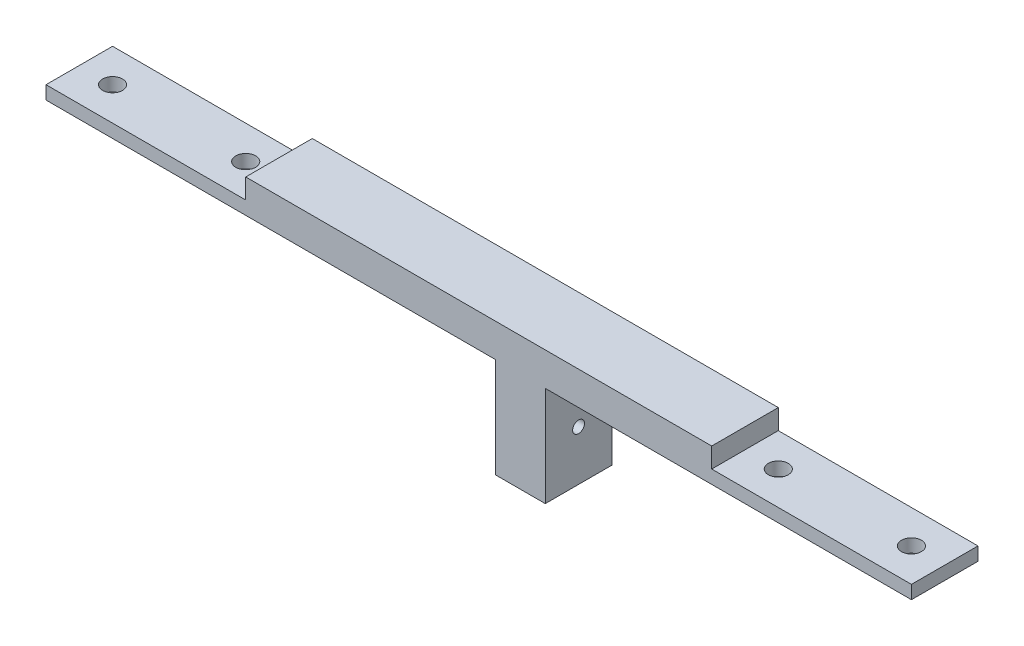
ISO-10303-21;
HEADER;
FILE_DESCRIPTION(('STEP AP214'),'2;1');
FILE_NAME('part.step','',(''),(''),'','','');
FILE_SCHEMA(('AUTOMOTIVE_DESIGN { 1 0 10303 214 1 1 1 1 }'));
ENDSEC;
DATA;
#1=APPLICATION_CONTEXT('core data for automotive mechanical design processes');
#2=APPLICATION_PROTOCOL_DEFINITION('international standard','automotive_design',2000,#1);
#3=PRODUCT_CONTEXT('',#1,'mechanical');
#4=PRODUCT('Part','Part','',(#3));
#5=PRODUCT_RELATED_PRODUCT_CATEGORY('part','',(#4));
#6=PRODUCT_DEFINITION_FORMATION('','',#4);
#7=PRODUCT_DEFINITION_CONTEXT('part definition',#1,'design');
#8=PRODUCT_DEFINITION('design','',#6,#7);
#9=PRODUCT_DEFINITION_SHAPE('','',#8);
#10=(LENGTH_UNIT() NAMED_UNIT(*) SI_UNIT(.MILLI.,.METRE.));
#11=(NAMED_UNIT(*) PLANE_ANGLE_UNIT() SI_UNIT($,.RADIAN.));
#12=(NAMED_UNIT(*) SI_UNIT($,.STERADIAN.) SOLID_ANGLE_UNIT());
#13=UNCERTAINTY_MEASURE_WITH_UNIT(LENGTH_MEASURE(1.E-05),#10,'distance_accuracy_value','');
#14=(GEOMETRIC_REPRESENTATION_CONTEXT(3) GLOBAL_UNCERTAINTY_ASSIGNED_CONTEXT((#13)) GLOBAL_UNIT_ASSIGNED_CONTEXT((#10,
#11,#12)) REPRESENTATION_CONTEXT('',''));
#15=CARTESIAN_POINT('',(0.,0.,0.));
#16=DIRECTION('',(0.,0.,1.));
#17=DIRECTION('',(1.,0.,0.));
#18=AXIS2_PLACEMENT_3D('',#15,#16,#17);
#19=CARTESIAN_POINT('',(0.,0.,0.));
#20=DIRECTION('',(0.,-1.,0.));
#21=DIRECTION('',(0.,0.,-1.));
#22=AXIS2_PLACEMENT_3D('',#19,#20,#21);
#23=PLANE('',#22);
#24=CARTESIAN_POINT('',(-76.2,0.,0.));
#25=DIRECTION('',(0.,-1.,0.));
#26=DIRECTION('',(0.,0.,-1.));
#27=AXIS2_PLACEMENT_3D('',#24,#25,#26);
#28=CIRCLE('',#27,1.89865);
#29=CARTESIAN_POINT('',(-76.2,0.,-1.89865));
#30=VERTEX_POINT('',#29);
#31=EDGE_CURVE('E191',#30,#30,#28,.T.);
#32=ORIENTED_EDGE('',*,*,#31,.F.);
#33=EDGE_LOOP('',(#32));
#34=FACE_BOUND('',#33,.T.);
#35=CARTESIAN_POINT('',(-50.8,0.,0.));
#36=DIRECTION('',(0.,-1.,0.));
#37=DIRECTION('',(0.,0.,-1.));
#38=AXIS2_PLACEMENT_3D('',#35,#36,#37);
#39=CIRCLE('',#38,1.89865);
#40=CARTESIAN_POINT('',(-50.8,0.,-1.89865));
#41=VERTEX_POINT('',#40);
#42=EDGE_CURVE('E184',#41,#41,#39,.T.);
#43=ORIENTED_EDGE('',*,*,#42,.F.);
#44=EDGE_LOOP('',(#43));
#45=FACE_BOUND('',#44,.T.);
#46=DIRECTION('',(1.,0.,0.));
#47=VECTOR('',#46,1.);
#48=CARTESIAN_POINT('',(-82.55,0.,-6.35));
#49=LINE('',#48,#47);
#50=CARTESIAN_POINT('',(-82.55,0.,-6.35));
#51=VERTEX_POINT('',#50);
#52=CARTESIAN_POINT('',(3.175,0.,-6.35));
#53=VERTEX_POINT('',#52);
#54=EDGE_CURVE('E226',#51,#53,#49,.T.);
#55=ORIENTED_EDGE('',*,*,#54,.T.);
#56=DIRECTION('',(0.,0.,1.));
#57=VECTOR('',#56,1.);
#58=CARTESIAN_POINT('',(3.175,0.,-27.6485474856855));
#59=LINE('',#58,#57);
#60=CARTESIAN_POINT('',(3.175,0.,6.35));
#61=VERTEX_POINT('',#60);
#62=EDGE_CURVE('E52',#53,#61,#59,.T.);
#63=ORIENTED_EDGE('',*,*,#62,.T.);
#64=DIRECTION('',(1.,0.,0.));
#65=VECTOR('',#64,1.);
#66=CARTESIAN_POINT('',(-82.55,0.,6.35));
#67=LINE('',#66,#65);
#68=CARTESIAN_POINT('',(-82.55,0.,6.35));
#69=VERTEX_POINT('',#68);
#70=EDGE_CURVE('E220',#69,#61,#67,.T.);
#71=ORIENTED_EDGE('',*,*,#70,.F.);
#72=DIRECTION('',(0.,0.,-1.));
#73=VECTOR('',#72,1.);
#74=CARTESIAN_POINT('',(-82.55,0.,6.35));
#75=LINE('',#74,#73);
#76=EDGE_CURVE('E212',#69,#51,#75,.T.);
#77=ORIENTED_EDGE('',*,*,#76,.T.);
#78=EDGE_LOOP('',(#55,#63,#71,#77));
#79=FACE_BOUND('',#78,.T.);
#80=ADVANCED_FACE('F35',(#34,#45,#79),#23,.T.);
#81=CARTESIAN_POINT('',(-82.55,6.35,6.35));
#82=DIRECTION('',(0.,0.,-1.));
#83=DIRECTION('',(-1.,0.,0.));
#84=AXIS2_PLACEMENT_3D('',#81,#82,#83);
#85=PLANE('',#84);
#86=DIRECTION('',(-1.,0.,0.));
#87=VECTOR('',#86,1.);
#88=CARTESIAN_POINT('',(82.55,2.54,6.35));
#89=LINE('',#88,#87);
#90=CARTESIAN_POINT('',(82.55,2.54,6.35));
#91=VERTEX_POINT('',#90);
#92=CARTESIAN_POINT('',(44.45,2.54,6.35));
#93=VERTEX_POINT('',#92);
#94=EDGE_CURVE('E174',#91,#93,#89,.T.);
#95=ORIENTED_EDGE('',*,*,#94,.T.);
#96=DIRECTION('',(0.,-1.,0.));
#97=VECTOR('',#96,1.);
#98=CARTESIAN_POINT('',(44.45,6.35,6.35));
#99=LINE('',#98,#97);
#100=CARTESIAN_POINT('',(44.45,6.35,6.35));
#101=VERTEX_POINT('',#100);
#102=EDGE_CURVE('E170',#101,#93,#99,.T.);
#103=ORIENTED_EDGE('',*,*,#102,.F.);
#104=DIRECTION('',(1.,0.,0.));
#105=VECTOR('',#104,1.);
#106=CARTESIAN_POINT('',(-82.55,6.35,6.35));
#107=LINE('',#106,#105);
#108=CARTESIAN_POINT('',(-44.45,6.35,6.35));
#109=VERTEX_POINT('',#108);
#110=EDGE_CURVE('E219',#109,#101,#107,.T.);
#111=ORIENTED_EDGE('',*,*,#110,.F.);
#112=DIRECTION('',(0.,-1.,0.));
#113=VECTOR('',#112,1.);
#114=CARTESIAN_POINT('',(-44.45,6.35,6.35));
#115=LINE('',#114,#113);
#116=CARTESIAN_POINT('',(-44.45,2.54,6.35));
#117=VERTEX_POINT('',#116);
#118=EDGE_CURVE('E202',#109,#117,#115,.T.);
#119=ORIENTED_EDGE('',*,*,#118,.T.);
#120=DIRECTION('',(1.,0.,0.));
#121=VECTOR('',#120,1.);
#122=CARTESIAN_POINT('',(-82.55,2.54,6.35));
#123=LINE('',#122,#121);
#124=CARTESIAN_POINT('',(-82.55,2.54,6.35));
#125=VERTEX_POINT('',#124);
#126=EDGE_CURVE('E197',#125,#117,#123,.T.);
#127=ORIENTED_EDGE('',*,*,#126,.F.);
#128=DIRECTION('',(0.,-1.,0.));
#129=VECTOR('',#128,1.);
#130=CARTESIAN_POINT('',(-82.55,6.35,6.35));
#131=LINE('',#130,#129);
#132=EDGE_CURVE('E11',#125,#69,#131,.T.);
#133=ORIENTED_EDGE('',*,*,#132,.T.);
#134=ORIENTED_EDGE('',*,*,#70,.T.);
#135=DIRECTION('',(0.,-1.,0.));
#136=VECTOR('',#135,1.);
#137=CARTESIAN_POINT('',(3.175,0.,6.35));
#138=LINE('',#137,#136);
#139=CARTESIAN_POINT('',(3.175,-19.05,6.35));
#140=VERTEX_POINT('',#139);
#141=EDGE_CURVE('E136',#61,#140,#138,.T.);
#142=ORIENTED_EDGE('',*,*,#141,.T.);
#143=DIRECTION('',(1.,0.,0.));
#144=VECTOR('',#143,1.);
#145=CARTESIAN_POINT('',(3.175,-19.05,6.35));
#146=LINE('',#145,#144);
#147=CARTESIAN_POINT('',(12.7,-19.05,6.35));
#148=VERTEX_POINT('',#147);
#149=EDGE_CURVE('E151',#140,#148,#146,.T.);
#150=ORIENTED_EDGE('',*,*,#149,.T.);
#151=DIRECTION('',(0.,-1.,0.));
#152=VECTOR('',#151,1.);
#153=CARTESIAN_POINT('',(12.7,0.,6.35));
#154=LINE('',#153,#152);
#155=CARTESIAN_POINT('',(12.7,0.,6.35));
#156=VERTEX_POINT('',#155);
#157=EDGE_CURVE('E143',#156,#148,#154,.T.);
#158=ORIENTED_EDGE('',*,*,#157,.F.);
#159=CARTESIAN_POINT('',(82.55,0.,6.35));
#160=VERTEX_POINT('',#159);
#161=EDGE_CURVE('E231',#156,#160,#67,.T.);
#162=ORIENTED_EDGE('',*,*,#161,.T.);
#163=DIRECTION('',(0.,-1.,0.));
#164=VECTOR('',#163,1.);
#165=CARTESIAN_POINT('',(82.55,6.35,6.35));
#166=LINE('',#165,#164);
#167=EDGE_CURVE('E44',#91,#160,#166,.T.);
#168=ORIENTED_EDGE('',*,*,#167,.F.);
#169=EDGE_LOOP('',(#95,#103,#111,#119,#127,#133,#134,#142,#150,#158,#162,#168));
#170=FACE_BOUND('',#169,.T.);
#171=ADVANCED_FACE('F260',(#170),#85,.F.);
#172=CARTESIAN_POINT('',(-82.55,6.35,-6.35));
#173=DIRECTION('',(0.,0.,-1.));
#174=DIRECTION('',(-1.,0.,0.));
#175=AXIS2_PLACEMENT_3D('',#172,#173,#174);
#176=PLANE('',#175);
#177=DIRECTION('',(0.,-1.,0.));
#178=VECTOR('',#177,1.);
#179=CARTESIAN_POINT('',(44.45,6.35,-6.35));
#180=LINE('',#179,#178);
#181=CARTESIAN_POINT('',(44.45,6.35,-6.35));
#182=VERTEX_POINT('',#181);
#183=CARTESIAN_POINT('',(44.45,2.54,-6.35));
#184=VERTEX_POINT('',#183);
#185=EDGE_CURVE('E171',#182,#184,#180,.T.);
#186=ORIENTED_EDGE('',*,*,#185,.T.);
#187=DIRECTION('',(-1.,0.,0.));
#188=VECTOR('',#187,1.);
#189=CARTESIAN_POINT('',(82.55,2.54,-6.35));
#190=LINE('',#189,#188);
#191=CARTESIAN_POINT('',(82.55,2.54,-6.35));
#192=VERTEX_POINT('',#191);
#193=EDGE_CURVE('E173',#192,#184,#190,.T.);
#194=ORIENTED_EDGE('',*,*,#193,.F.);
#195=DIRECTION('',(0.,-1.,0.));
#196=VECTOR('',#195,1.);
#197=CARTESIAN_POINT('',(82.55,6.35,-6.35));
#198=LINE('',#197,#196);
#199=CARTESIAN_POINT('',(82.55,0.,-6.35));
#200=VERTEX_POINT('',#199);
#201=EDGE_CURVE('E235',#192,#200,#198,.T.);
#202=ORIENTED_EDGE('',*,*,#201,.T.);
#203=CARTESIAN_POINT('',(12.7,0.,-6.35));
#204=VERTEX_POINT('',#203);
#205=EDGE_CURVE('E134',#204,#200,#49,.T.);
#206=ORIENTED_EDGE('',*,*,#205,.F.);
#207=DIRECTION('',(0.,-1.,0.));
#208=VECTOR('',#207,1.);
#209=CARTESIAN_POINT('',(12.7,0.,-6.35));
#210=LINE('',#209,#208);
#211=CARTESIAN_POINT('',(12.7,-19.05,-6.35));
#212=VERTEX_POINT('',#211);
#213=EDGE_CURVE('E125',#204,#212,#210,.T.);
#214=ORIENTED_EDGE('',*,*,#213,.T.);
#215=DIRECTION('',(1.,0.,0.));
#216=VECTOR('',#215,1.);
#217=CARTESIAN_POINT('',(3.175,-19.05,-6.35));
#218=LINE('',#217,#216);
#219=CARTESIAN_POINT('',(3.175,-19.05,-6.35));
#220=VERTEX_POINT('',#219);
#221=EDGE_CURVE('E131',#220,#212,#218,.T.);
#222=ORIENTED_EDGE('',*,*,#221,.F.);
#223=DIRECTION('',(0.,-1.,0.));
#224=VECTOR('',#223,1.);
#225=CARTESIAN_POINT('',(3.175,0.,-6.35));
#226=LINE('',#225,#224);
#227=EDGE_CURVE('E156',#53,#220,#226,.T.);
#228=ORIENTED_EDGE('',*,*,#227,.F.);
#229=ORIENTED_EDGE('',*,*,#54,.F.);
#230=DIRECTION('',(0.,-1.,0.));
#231=VECTOR('',#230,1.);
#232=CARTESIAN_POINT('',(-82.55,6.35,-6.35));
#233=LINE('',#232,#231);
#234=CARTESIAN_POINT('',(-82.55,2.54,-6.35));
#235=VERTEX_POINT('',#234);
#236=EDGE_CURVE('E223',#235,#51,#233,.T.);
#237=ORIENTED_EDGE('',*,*,#236,.F.);
#238=DIRECTION('',(1.,0.,0.));
#239=VECTOR('',#238,1.);
#240=CARTESIAN_POINT('',(-82.55,2.54,-6.35));
#241=LINE('',#240,#239);
#242=CARTESIAN_POINT('',(-44.45,2.54,-6.35));
#243=VERTEX_POINT('',#242);
#244=EDGE_CURVE('E198',#235,#243,#241,.T.);
#245=ORIENTED_EDGE('',*,*,#244,.T.);
#246=DIRECTION('',(0.,-1.,0.));
#247=VECTOR('',#246,1.);
#248=CARTESIAN_POINT('',(-44.45,6.35,-6.35));
#249=LINE('',#248,#247);
#250=CARTESIAN_POINT('',(-44.45,6.35,-6.35));
#251=VERTEX_POINT('',#250);
#252=EDGE_CURVE('E201',#251,#243,#249,.T.);
#253=ORIENTED_EDGE('',*,*,#252,.F.);
#254=DIRECTION('',(1.,0.,0.));
#255=VECTOR('',#254,1.);
#256=CARTESIAN_POINT('',(-82.55,6.35,-6.35));
#257=LINE('',#256,#255);
#258=EDGE_CURVE('E216',#251,#182,#257,.T.);
#259=ORIENTED_EDGE('',*,*,#258,.T.);
#260=EDGE_LOOP('',(#186,#194,#202,#206,#214,#222,#228,#229,#237,#245,#253,#259));
#261=FACE_BOUND('',#260,.T.);
#262=ADVANCED_FACE('F128',(#261),#176,.T.);
#263=CARTESIAN_POINT('',(82.55,6.35,6.35));
#264=DIRECTION('',(-1.,0.,0.));
#265=DIRECTION('',(0.,0.,1.));
#266=AXIS2_PLACEMENT_3D('',#263,#264,#265);
#267=PLANE('',#266);
#268=DIRECTION('',(0.,0.,1.));
#269=VECTOR('',#268,1.);
#270=CARTESIAN_POINT('',(82.55,2.54,-6.35));
#271=LINE('',#270,#269);
#272=EDGE_CURVE('E181',#192,#91,#271,.T.);
#273=ORIENTED_EDGE('',*,*,#272,.T.);
#274=ORIENTED_EDGE('',*,*,#167,.T.);
#275=DIRECTION('',(0.,0.,-1.));
#276=VECTOR('',#275,1.);
#277=CARTESIAN_POINT('',(82.55,0.,6.35));
#278=LINE('',#277,#276);
#279=EDGE_CURVE('E228',#160,#200,#278,.T.);
#280=ORIENTED_EDGE('',*,*,#279,.T.);
#281=ORIENTED_EDGE('',*,*,#201,.F.);
#282=EDGE_LOOP('',(#273,#274,#280,#281));
#283=FACE_BOUND('',#282,.T.);
#284=ADVANCED_FACE('F350',(#283),#267,.F.);
#285=CARTESIAN_POINT('',(0.,6.35,0.));
#286=DIRECTION('',(0.,-1.,0.));
#287=DIRECTION('',(0.,0.,-1.));
#288=AXIS2_PLACEMENT_3D('',#285,#286,#287);
#289=PLANE('',#288);
#290=ORIENTED_EDGE('',*,*,#110,.T.);
#291=DIRECTION('',(0.,0.,1.));
#292=VECTOR('',#291,1.);
#293=CARTESIAN_POINT('',(44.45,6.35,-6.35));
#294=LINE('',#293,#292);
#295=EDGE_CURVE('E176',#182,#101,#294,.T.);
#296=ORIENTED_EDGE('',*,*,#295,.F.);
#297=ORIENTED_EDGE('',*,*,#258,.F.);
#298=DIRECTION('',(0.,0.,1.));
#299=VECTOR('',#298,1.);
#300=CARTESIAN_POINT('',(-44.45,6.35,-6.35));
#301=LINE('',#300,#299);
#302=EDGE_CURVE('E209',#251,#109,#301,.T.);
#303=ORIENTED_EDGE('',*,*,#302,.T.);
#304=EDGE_LOOP('',(#290,#296,#297,#303));
#305=FACE_BOUND('',#304,.T.);
#306=ADVANCED_FACE('F284',(#305),#289,.F.);
#307=CARTESIAN_POINT('',(-82.55,6.35,6.35));
#308=DIRECTION('',(-1.,0.,0.));
#309=DIRECTION('',(0.,0.,1.));
#310=AXIS2_PLACEMENT_3D('',#307,#308,#309);
#311=PLANE('',#310);
#312=DIRECTION('',(0.,0.,1.));
#313=VECTOR('',#312,1.);
#314=CARTESIAN_POINT('',(-82.55,2.54,-6.35));
#315=LINE('',#314,#313);
#316=EDGE_CURVE('E204',#235,#125,#315,.T.);
#317=ORIENTED_EDGE('',*,*,#316,.F.);
#318=ORIENTED_EDGE('',*,*,#236,.T.);
#319=ORIENTED_EDGE('',*,*,#76,.F.);
#320=ORIENTED_EDGE('',*,*,#132,.F.);
#321=EDGE_LOOP('',(#317,#318,#319,#320));
#322=FACE_BOUND('',#321,.T.);
#323=ADVANCED_FACE('F37',(#322),#311,.T.);
#324=DIRECTION('',(0.,0.,1.));
#325=VECTOR('',#324,1.);
#326=CARTESIAN_POINT('',(12.7,0.,-27.6485474856855));
#327=LINE('',#326,#325);
#328=EDGE_CURVE('E60',#204,#156,#327,.T.);
#329=ORIENTED_EDGE('',*,*,#328,.F.);
#330=ORIENTED_EDGE('',*,*,#205,.T.);
#331=ORIENTED_EDGE('',*,*,#279,.F.);
#332=ORIENTED_EDGE('',*,*,#161,.F.);
#333=EDGE_LOOP('',(#329,#330,#331,#332));
#334=FACE_BOUND('',#333,.T.);
#335=CARTESIAN_POINT('',(50.8,0.,0.));
#336=DIRECTION('',(0.,-1.,0.));
#337=DIRECTION('',(0.,0.,-1.));
#338=AXIS2_PLACEMENT_3D('',#335,#336,#337);
#339=CIRCLE('',#338,1.89865);
#340=CARTESIAN_POINT('',(50.8,0.,-1.89865));
#341=VERTEX_POINT('',#340);
#342=EDGE_CURVE('E161',#341,#341,#339,.T.);
#343=ORIENTED_EDGE('',*,*,#342,.F.);
#344=EDGE_LOOP('',(#343));
#345=FACE_BOUND('',#344,.T.);
#346=CARTESIAN_POINT('',(76.2,0.,0.));
#347=DIRECTION('',(0.,-1.,0.));
#348=DIRECTION('',(0.,0.,-1.));
#349=AXIS2_PLACEMENT_3D('',#346,#347,#348);
#350=CIRCLE('',#349,1.89865);
#351=CARTESIAN_POINT('',(76.2,0.,-1.89865));
#352=VERTEX_POINT('',#351);
#353=EDGE_CURVE('E164',#352,#352,#350,.T.);
#354=ORIENTED_EDGE('',*,*,#353,.F.);
#355=EDGE_LOOP('',(#354));
#356=FACE_BOUND('',#355,.T.);
#357=ADVANCED_FACE('F263',(#334,#345,#356),#23,.T.);
#358=CARTESIAN_POINT('',(-44.45,6.35,-6.35));
#359=DIRECTION('',(-1.,0.,0.));
#360=DIRECTION('',(0.,0.,1.));
#361=AXIS2_PLACEMENT_3D('',#358,#359,#360);
#362=PLANE('',#361);
#363=ORIENTED_EDGE('',*,*,#118,.F.);
#364=ORIENTED_EDGE('',*,*,#302,.F.);
#365=ORIENTED_EDGE('',*,*,#252,.T.);
#366=DIRECTION('',(0.,0.,1.));
#367=VECTOR('',#366,1.);
#368=CARTESIAN_POINT('',(-44.45,2.54,-6.35));
#369=LINE('',#368,#367);
#370=EDGE_CURVE('E213',#243,#117,#369,.T.);
#371=ORIENTED_EDGE('',*,*,#370,.T.);
#372=EDGE_LOOP('',(#363,#364,#365,#371));
#373=FACE_BOUND('',#372,.T.);
#374=ADVANCED_FACE('F275',(#373),#362,.T.);
#375=CARTESIAN_POINT('',(-82.55,2.54,-6.35));
#376=DIRECTION('',(0.,-1.,0.));
#377=DIRECTION('',(0.,0.,-1.));
#378=AXIS2_PLACEMENT_3D('',#375,#376,#377);
#379=PLANE('',#378);
#380=CARTESIAN_POINT('',(-50.8,2.54,0.));
#381=DIRECTION('',(0.,-1.,0.));
#382=DIRECTION('',(0.,0.,-1.));
#383=AXIS2_PLACEMENT_3D('',#380,#381,#382);
#384=CIRCLE('',#383,1.89865);
#385=CARTESIAN_POINT('',(-50.8,2.54,-1.89865));
#386=VERTEX_POINT('',#385);
#387=EDGE_CURVE('E190',#386,#386,#384,.T.);
#388=ORIENTED_EDGE('',*,*,#387,.T.);
#389=EDGE_LOOP('',(#388));
#390=FACE_BOUND('',#389,.T.);
#391=CARTESIAN_POINT('',(-76.2,2.54,0.));
#392=DIRECTION('',(0.,-1.,0.));
#393=DIRECTION('',(0.,0.,-1.));
#394=AXIS2_PLACEMENT_3D('',#391,#392,#393);
#395=CIRCLE('',#394,1.89865);
#396=CARTESIAN_POINT('',(-76.2,2.54,-1.89865));
#397=VERTEX_POINT('',#396);
#398=EDGE_CURVE('E194',#397,#397,#395,.T.);
#399=ORIENTED_EDGE('',*,*,#398,.T.);
#400=EDGE_LOOP('',(#399));
#401=FACE_BOUND('',#400,.T.);
#402=ORIENTED_EDGE('',*,*,#126,.T.);
#403=ORIENTED_EDGE('',*,*,#370,.F.);
#404=ORIENTED_EDGE('',*,*,#244,.F.);
#405=ORIENTED_EDGE('',*,*,#316,.T.);
#406=EDGE_LOOP('',(#402,#403,#404,#405));
#407=FACE_BOUND('',#406,.T.);
#408=ADVANCED_FACE('F240',(#390,#401,#407),#379,.F.);
#409=CARTESIAN_POINT('',(-76.2,0.,0.));
#410=DIRECTION('',(0.,-1.,0.));
#411=DIRECTION('',(0.,0.,-1.));
#412=AXIS2_PLACEMENT_3D('',#409,#410,#411);
#413=CYLINDRICAL_SURFACE('',#412,1.89865);
#414=ORIENTED_EDGE('',*,*,#31,.T.);
#415=EDGE_LOOP('',(#414));
#416=FACE_BOUND('',#415,.T.);
#417=ORIENTED_EDGE('',*,*,#398,.F.);
#418=EDGE_LOOP('',(#417));
#419=FACE_BOUND('',#418,.T.);
#420=ADVANCED_FACE('F246',(#416,#419),#413,.F.);
#421=CARTESIAN_POINT('',(-50.8,0.,0.));
#422=DIRECTION('',(0.,-1.,0.));
#423=DIRECTION('',(0.,0.,-1.));
#424=AXIS2_PLACEMENT_3D('',#421,#422,#423);
#425=CYLINDRICAL_SURFACE('',#424,1.89865);
#426=ORIENTED_EDGE('',*,*,#42,.T.);
#427=EDGE_LOOP('',(#426));
#428=FACE_BOUND('',#427,.T.);
#429=ORIENTED_EDGE('',*,*,#387,.F.);
#430=EDGE_LOOP('',(#429));
#431=FACE_BOUND('',#430,.T.);
#432=ADVANCED_FACE('F243',(#428,#431),#425,.F.);
#433=CARTESIAN_POINT('',(82.55,2.54,-6.35));
#434=DIRECTION('',(0.,1.,0.));
#435=DIRECTION('',(0.,0.,1.));
#436=AXIS2_PLACEMENT_3D('',#433,#434,#435);
#437=PLANE('',#436);
#438=CARTESIAN_POINT('',(50.8,2.54,0.));
#439=DIRECTION('',(0.,1.,0.));
#440=DIRECTION('',(0.,0.,1.));
#441=AXIS2_PLACEMENT_3D('',#438,#439,#440);
#442=CIRCLE('',#441,1.89865);
#443=CARTESIAN_POINT('',(50.8,2.54,1.89865));
#444=VERTEX_POINT('',#443);
#445=EDGE_CURVE('E39',#444,#444,#442,.T.);
#446=ORIENTED_EDGE('',*,*,#445,.F.);
#447=EDGE_LOOP('',(#446));
#448=FACE_BOUND('',#447,.T.);
#449=CARTESIAN_POINT('',(76.2,2.54,0.));
#450=DIRECTION('',(0.,1.,0.));
#451=DIRECTION('',(0.,0.,1.));
#452=AXIS2_PLACEMENT_3D('',#449,#450,#451);
#453=CIRCLE('',#452,1.89865);
#454=CARTESIAN_POINT('',(76.2,2.54,1.89865));
#455=VERTEX_POINT('',#454);
#456=EDGE_CURVE('E167',#455,#455,#453,.T.);
#457=ORIENTED_EDGE('',*,*,#456,.F.);
#458=EDGE_LOOP('',(#457));
#459=FACE_BOUND('',#458,.T.);
#460=ORIENTED_EDGE('',*,*,#94,.F.);
#461=ORIENTED_EDGE('',*,*,#272,.F.);
#462=ORIENTED_EDGE('',*,*,#193,.T.);
#463=DIRECTION('',(0.,0.,1.));
#464=VECTOR('',#463,1.);
#465=CARTESIAN_POINT('',(44.45,2.54,-6.35));
#466=LINE('',#465,#464);
#467=EDGE_CURVE('E185',#184,#93,#466,.T.);
#468=ORIENTED_EDGE('',*,*,#467,.T.);
#469=EDGE_LOOP('',(#460,#461,#462,#468));
#470=FACE_BOUND('',#469,.T.);
#471=ADVANCED_FACE('F245',(#448,#459,#470),#437,.T.);
#472=CARTESIAN_POINT('',(44.45,6.35,-6.35));
#473=DIRECTION('',(-1.,0.,0.));
#474=DIRECTION('',(0.,0.,1.));
#475=AXIS2_PLACEMENT_3D('',#472,#473,#474);
#476=PLANE('',#475);
#477=ORIENTED_EDGE('',*,*,#102,.T.);
#478=ORIENTED_EDGE('',*,*,#467,.F.);
#479=ORIENTED_EDGE('',*,*,#185,.F.);
#480=ORIENTED_EDGE('',*,*,#295,.T.);
#481=EDGE_LOOP('',(#477,#478,#479,#480));
#482=FACE_BOUND('',#481,.T.);
#483=ADVANCED_FACE('F253',(#482),#476,.F.);
#484=CARTESIAN_POINT('',(76.2,0.,0.));
#485=DIRECTION('',(0.,-1.,0.));
#486=DIRECTION('',(0.,0.,-1.));
#487=AXIS2_PLACEMENT_3D('',#484,#485,#486);
#488=CYLINDRICAL_SURFACE('',#487,1.89865);
#489=ORIENTED_EDGE('',*,*,#456,.T.);
#490=EDGE_LOOP('',(#489));
#491=FACE_BOUND('',#490,.T.);
#492=ORIENTED_EDGE('',*,*,#353,.T.);
#493=EDGE_LOOP('',(#492));
#494=FACE_BOUND('',#493,.T.);
#495=ADVANCED_FACE('F291',(#491,#494),#488,.F.);
#496=CARTESIAN_POINT('',(50.8,0.,0.));
#497=DIRECTION('',(0.,-1.,0.));
#498=DIRECTION('',(0.,0.,-1.));
#499=AXIS2_PLACEMENT_3D('',#496,#497,#498);
#500=CYLINDRICAL_SURFACE('',#499,1.89865);
#501=ORIENTED_EDGE('',*,*,#445,.T.);
#502=EDGE_LOOP('',(#501));
#503=FACE_BOUND('',#502,.T.);
#504=ORIENTED_EDGE('',*,*,#342,.T.);
#505=EDGE_LOOP('',(#504));
#506=FACE_BOUND('',#505,.T.);
#507=ADVANCED_FACE('F293',(#503,#506),#500,.F.);
#508=CARTESIAN_POINT('',(3.175,-19.05,-27.6485474856855));
#509=DIRECTION('',(0.,-1.,0.));
#510=DIRECTION('',(1.,0.,0.));
#511=AXIS2_PLACEMENT_3D('',#508,#509,#510);
#512=PLANE('',#511);
#513=DIRECTION('',(0.,0.,1.));
#514=VECTOR('',#513,1.);
#515=CARTESIAN_POINT('',(3.175,-19.05,-27.6485474856855));
#516=LINE('',#515,#514);
#517=EDGE_CURVE('E150',#220,#140,#516,.T.);
#518=ORIENTED_EDGE('',*,*,#517,.F.);
#519=ORIENTED_EDGE('',*,*,#221,.T.);
#520=DIRECTION('',(0.,0.,1.));
#521=VECTOR('',#520,1.);
#522=CARTESIAN_POINT('',(12.7,-19.05,-27.6485474856855));
#523=LINE('',#522,#521);
#524=EDGE_CURVE('E140',#212,#148,#523,.T.);
#525=ORIENTED_EDGE('',*,*,#524,.T.);
#526=ORIENTED_EDGE('',*,*,#149,.F.);
#527=EDGE_LOOP('',(#518,#519,#525,#526));
#528=FACE_BOUND('',#527,.T.);
#529=ADVANCED_FACE('F149',(#528),#512,.T.);
#530=CARTESIAN_POINT('',(12.7,0.,-27.6485474856855));
#531=DIRECTION('',(-1.,0.,0.));
#532=DIRECTION('',(0.,-1.,0.));
#533=AXIS2_PLACEMENT_3D('',#530,#531,#532);
#534=PLANE('',#533);
#535=CARTESIAN_POINT('',(12.7,-9.525,0.));
#536=DIRECTION('',(1.,0.,0.));
#537=DIRECTION('',(0.,0.,-1.));
#538=AXIS2_PLACEMENT_3D('',#535,#536,#537);
#539=CIRCLE('',#538,1.1303);
#540=CARTESIAN_POINT('',(12.7,-9.525,-1.1303));
#541=VERTEX_POINT('',#540);
#542=EDGE_CURVE('E323',#541,#541,#539,.T.);
#543=ORIENTED_EDGE('',*,*,#542,.F.);
#544=EDGE_LOOP('',(#543));
#545=FACE_BOUND('',#544,.T.);
#546=ORIENTED_EDGE('',*,*,#213,.F.);
#547=ORIENTED_EDGE('',*,*,#328,.T.);
#548=ORIENTED_EDGE('',*,*,#157,.T.);
#549=ORIENTED_EDGE('',*,*,#524,.F.);
#550=EDGE_LOOP('',(#546,#547,#548,#549));
#551=FACE_BOUND('',#550,.T.);
#552=ADVANCED_FACE('F141',(#545,#551),#534,.F.);
#553=CARTESIAN_POINT('',(3.175,0.,-27.6485474856855));
#554=DIRECTION('',(-1.,0.,0.));
#555=DIRECTION('',(0.,-1.,0.));
#556=AXIS2_PLACEMENT_3D('',#553,#554,#555);
#557=PLANE('',#556);
#558=CARTESIAN_POINT('',(3.175,-9.525,0.));
#559=DIRECTION('',(-1.,0.,0.));
#560=DIRECTION('',(0.,-1.,0.));
#561=AXIS2_PLACEMENT_3D('',#558,#559,#560);
#562=CIRCLE('',#561,1.13029999999999);
#563=CARTESIAN_POINT('',(3.175,-10.6553,0.));
#564=VERTEX_POINT('',#563);
#565=EDGE_CURVE('E137',#564,#564,#562,.T.);
#566=ORIENTED_EDGE('',*,*,#565,.F.);
#567=EDGE_LOOP('',(#566));
#568=FACE_BOUND('',#567,.T.);
#569=ORIENTED_EDGE('',*,*,#62,.F.);
#570=ORIENTED_EDGE('',*,*,#227,.T.);
#571=ORIENTED_EDGE('',*,*,#517,.T.);
#572=ORIENTED_EDGE('',*,*,#141,.F.);
#573=EDGE_LOOP('',(#569,#570,#571,#572));
#574=FACE_BOUND('',#573,.T.);
#575=ADVANCED_FACE('F308',(#568,#574),#557,.T.);
#576=CARTESIAN_POINT('',(12.7,-9.525,0.));
#577=DIRECTION('',(1.,0.,0.));
#578=DIRECTION('',(0.,0.,-1.));
#579=AXIS2_PLACEMENT_3D('',#576,#577,#578);
#580=CYLINDRICAL_SURFACE('',#579,1.13029999999999);
#581=ORIENTED_EDGE('',*,*,#565,.T.);
#582=EDGE_LOOP('',(#581));
#583=FACE_BOUND('',#582,.T.);
#584=ORIENTED_EDGE('',*,*,#542,.T.);
#585=EDGE_LOOP('',(#584));
#586=FACE_BOUND('',#585,.T.);
#587=ADVANCED_FACE('F312',(#583,#586),#580,.F.);
#588=CLOSED_SHELL('',(#80,#171,#262,#284,#306,#323,#357,#374,#408,#420,#432,#471,#483,#495,#507,
#529,#552,#575,#587));
#589=MANIFOLD_SOLID_BREP('B2',#588);
#590=ADVANCED_BREP_SHAPE_REPRESENTATION('',(#18,#589),#14);
#591=SHAPE_DEFINITION_REPRESENTATION(#9,#590);
ENDSEC;
END-ISO-10303-21;
